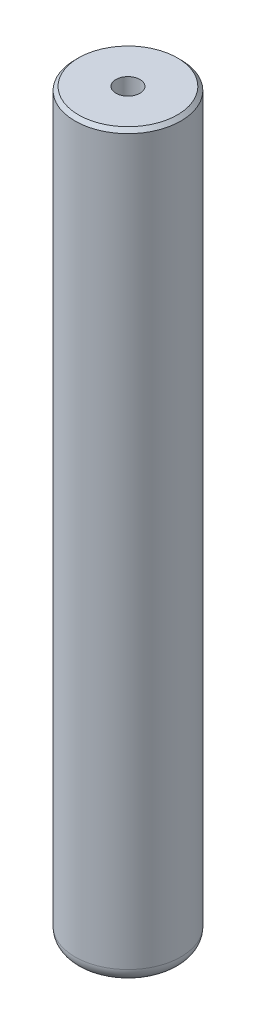
ISO-10303-21;
HEADER;
FILE_DESCRIPTION(('STEP AP214'),'2;1');
FILE_NAME('part.step','',(''),(''),'','','');
FILE_SCHEMA(('AUTOMOTIVE_DESIGN { 1 0 10303 214 1 1 1 1 }'));
ENDSEC;
DATA;
#1=APPLICATION_CONTEXT('core data for automotive mechanical design processes');
#2=APPLICATION_PROTOCOL_DEFINITION('international standard','automotive_design',2000,#1);
#3=PRODUCT_CONTEXT('',#1,'mechanical');
#4=PRODUCT('Part','Part','',(#3));
#5=PRODUCT_RELATED_PRODUCT_CATEGORY('part','',(#4));
#6=PRODUCT_DEFINITION_FORMATION('','',#4);
#7=PRODUCT_DEFINITION_CONTEXT('part definition',#1,'design');
#8=PRODUCT_DEFINITION('design','',#6,#7);
#9=PRODUCT_DEFINITION_SHAPE('','',#8);
#10=(LENGTH_UNIT() NAMED_UNIT(*) SI_UNIT(.MILLI.,.METRE.));
#11=(NAMED_UNIT(*) PLANE_ANGLE_UNIT() SI_UNIT($,.RADIAN.));
#12=(NAMED_UNIT(*) SI_UNIT($,.STERADIAN.) SOLID_ANGLE_UNIT());
#13=UNCERTAINTY_MEASURE_WITH_UNIT(LENGTH_MEASURE(1.E-05),#10,'distance_accuracy_value','');
#14=(GEOMETRIC_REPRESENTATION_CONTEXT(3) GLOBAL_UNCERTAINTY_ASSIGNED_CONTEXT((#13)) GLOBAL_UNIT_ASSIGNED_CONTEXT((#10,
#11,#12)) REPRESENTATION_CONTEXT('',''));
#15=CARTESIAN_POINT('',(0.,0.,0.));
#16=DIRECTION('',(0.,0.,1.));
#17=DIRECTION('',(1.,0.,0.));
#18=AXIS2_PLACEMENT_3D('',#15,#16,#17);
#19=CARTESIAN_POINT('',(0.,210.,0.));
#20=DIRECTION('',(0.,-1.,0.));
#21=DIRECTION('',(0.,0.,-1.));
#22=AXIS2_PLACEMENT_3D('',#19,#20,#21);
#23=CYLINDRICAL_SURFACE('',#22,15.);
#24=CARTESIAN_POINT('',(0.,209.,0.));
#25=DIRECTION('',(0.,1.,0.));
#26=DIRECTION('',(0.,0.,1.));
#27=AXIS2_PLACEMENT_3D('',#24,#25,#26);
#28=CIRCLE('',#27,15.);
#29=CARTESIAN_POINT('',(0.,209.,15.));
#30=VERTEX_POINT('',#29);
#31=EDGE_CURVE('E11',#30,#30,#28,.F.);
#32=ORIENTED_EDGE('',*,*,#31,.T.);
#33=EDGE_LOOP('',(#32));
#34=FACE_BOUND('',#33,.T.);
#35=CARTESIAN_POINT('',(0.,4.,0.));
#36=DIRECTION('',(0.,1.,0.));
#37=DIRECTION('',(0.,0.,1.));
#38=AXIS2_PLACEMENT_3D('',#35,#36,#37);
#39=CIRCLE('',#38,15.);
#40=CARTESIAN_POINT('',(0.,4.,15.));
#41=VERTEX_POINT('',#40);
#42=EDGE_CURVE('E79',#41,#41,#39,.T.);
#43=ORIENTED_EDGE('',*,*,#42,.T.);
#44=EDGE_LOOP('',(#43));
#45=FACE_BOUND('',#44,.T.);
#46=ADVANCED_FACE('F57',(#34,#45),#23,.T.);
#47=CARTESIAN_POINT('',(0.,210.,0.));
#48=DIRECTION('',(0.,1.,0.));
#49=DIRECTION('',(0.,0.,1.));
#50=AXIS2_PLACEMENT_3D('',#47,#48,#49);
#51=PLANE('',#50);
#52=CARTESIAN_POINT('',(0.,210.,0.));
#53=DIRECTION('',(0.,1.,0.));
#54=DIRECTION('',(0.,0.,1.));
#55=AXIS2_PLACEMENT_3D('',#52,#53,#54);
#56=CIRCLE('',#55,3.39999999999999);
#57=CARTESIAN_POINT('',(0.,210.,3.39999999999999));
#58=VERTEX_POINT('',#57);
#59=EDGE_CURVE('E80',#58,#58,#56,.T.);
#60=ORIENTED_EDGE('',*,*,#59,.F.);
#61=EDGE_LOOP('',(#60));
#62=FACE_BOUND('',#61,.T.);
#63=CARTESIAN_POINT('',(0.,210.,0.));
#64=DIRECTION('',(0.,1.,0.));
#65=DIRECTION('',(0.,0.,1.));
#66=AXIS2_PLACEMENT_3D('',#63,#64,#65);
#67=CIRCLE('',#66,14.);
#68=CARTESIAN_POINT('',(0.,210.,14.));
#69=VERTEX_POINT('',#68);
#70=EDGE_CURVE('E66',#69,#69,#67,.T.);
#71=ORIENTED_EDGE('',*,*,#70,.T.);
#72=EDGE_LOOP('',(#71));
#73=FACE_BOUND('',#72,.T.);
#74=ADVANCED_FACE('F96',(#62,#73),#51,.T.);
#75=CARTESIAN_POINT('',(0.,0.,0.));
#76=DIRECTION('',(0.,1.,0.));
#77=DIRECTION('',(0.,0.,1.));
#78=AXIS2_PLACEMENT_3D('',#75,#76,#77);
#79=PLANE('',#78);
#80=CARTESIAN_POINT('',(0.,0.,0.));
#81=DIRECTION('',(0.,1.,0.));
#82=DIRECTION('',(0.,0.,1.));
#83=AXIS2_PLACEMENT_3D('',#80,#81,#82);
#84=CIRCLE('',#83,11.);
#85=CARTESIAN_POINT('',(0.,0.,11.));
#86=VERTEX_POINT('',#85);
#87=EDGE_CURVE('E85',#86,#86,#84,.F.);
#88=ORIENTED_EDGE('',*,*,#87,.T.);
#89=EDGE_LOOP('',(#88));
#90=FACE_BOUND('',#89,.T.);
#91=ADVANCED_FACE('F106',(#90),#79,.F.);
#92=CARTESIAN_POINT('',(0.,4.,0.));
#93=DIRECTION('',(0.,1.,0.));
#94=DIRECTION('',(0.,0.,1.));
#95=AXIS2_PLACEMENT_3D('',#92,#93,#94);
#96=TOROIDAL_SURFACE('',#95,11.,4.);
#97=ORIENTED_EDGE('',*,*,#87,.F.);
#98=EDGE_LOOP('',(#97));
#99=FACE_BOUND('',#98,.T.);
#100=ORIENTED_EDGE('',*,*,#42,.F.);
#101=EDGE_LOOP('',(#100));
#102=FACE_BOUND('',#101,.T.);
#103=ADVANCED_FACE('F99',(#99,#102),#96,.T.);
#104=CARTESIAN_POINT('',(0.,210.,0.));
#105=DIRECTION('',(0.,-1.,0.));
#106=DIRECTION('',(0.,0.,-1.));
#107=AXIS2_PLACEMENT_3D('',#104,#105,#106);
#108=CONICAL_SURFACE('',#107,14.,0.785398163397442);
#109=ORIENTED_EDGE('',*,*,#31,.F.);
#110=EDGE_LOOP('',(#109));
#111=FACE_BOUND('',#110,.T.);
#112=ORIENTED_EDGE('',*,*,#70,.F.);
#113=EDGE_LOOP('',(#112));
#114=FACE_BOUND('',#113,.T.);
#115=ADVANCED_FACE('F60',(#111,#114),#108,.T.);
#116=CARTESIAN_POINT('',(0.,190.25,0.));
#117=DIRECTION('',(0.,1.,0.));
#118=DIRECTION('',(0.,0.,1.));
#119=AXIS2_PLACEMENT_3D('',#116,#117,#118);
#120=CONICAL_SURFACE('',#119,3.39999999999999,1.02974425867665);
#121=CARTESIAN_POINT('',(0.,188.207073895306,0.));
#122=VERTEX_POINT('',#121);
#123=VERTEX_LOOP('',#122);
#124=FACE_BOUND('',#123,.T.);
#125=CARTESIAN_POINT('',(0.,190.25,0.));
#126=DIRECTION('',(0.,1.,0.));
#127=DIRECTION('',(0.,0.,1.));
#128=AXIS2_PLACEMENT_3D('',#125,#126,#127);
#129=CIRCLE('',#128,3.39999999999999);
#130=CARTESIAN_POINT('',(0.,190.25,3.39999999999999));
#131=VERTEX_POINT('',#130);
#132=EDGE_CURVE('E76',#131,#131,#129,.T.);
#133=ORIENTED_EDGE('',*,*,#132,.T.);
#134=EDGE_LOOP('',(#133));
#135=FACE_BOUND('',#134,.T.);
#136=ADVANCED_FACE('F69',(#124,#135),#120,.F.);
#137=CARTESIAN_POINT('',(0.,210.,0.));
#138=DIRECTION('',(0.,1.,0.));
#139=DIRECTION('',(0.,0.,1.));
#140=AXIS2_PLACEMENT_3D('',#137,#138,#139);
#141=CYLINDRICAL_SURFACE('',#140,3.39999999999999);
#142=ORIENTED_EDGE('',*,*,#132,.F.);
#143=EDGE_LOOP('',(#142));
#144=FACE_BOUND('',#143,.T.);
#145=ORIENTED_EDGE('',*,*,#59,.T.);
#146=EDGE_LOOP('',(#145));
#147=FACE_BOUND('',#146,.T.);
#148=ADVANCED_FACE('F72',(#144,#147),#141,.F.);
#149=CLOSED_SHELL('',(#46,#74,#91,#103,#115,#136,#148));
#150=MANIFOLD_SOLID_BREP('B2',#149);
#151=ADVANCED_BREP_SHAPE_REPRESENTATION('',(#18,#150),#14);
#152=SHAPE_DEFINITION_REPRESENTATION(#9,#151);
ENDSEC;
END-ISO-10303-21;
